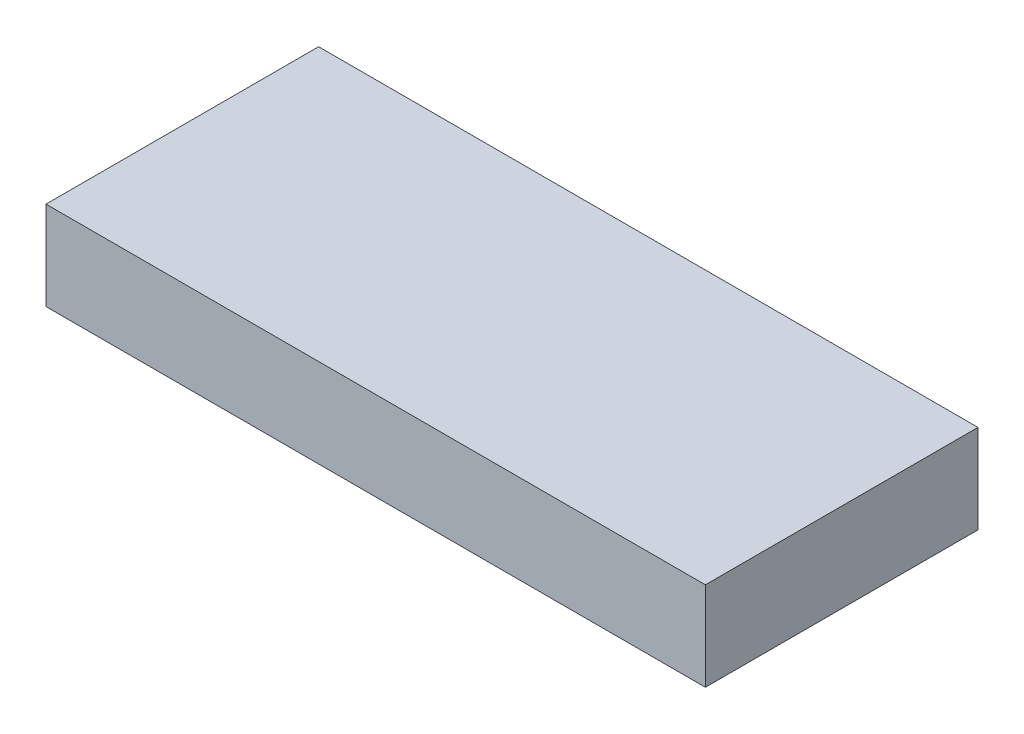
ISO-10303-21;
HEADER;
FILE_DESCRIPTION(('STEP AP214'),'2;1');
FILE_NAME('part.step','',(''),(''),'','','');
FILE_SCHEMA(('AUTOMOTIVE_DESIGN { 1 0 10303 214 1 1 1 1 }'));
ENDSEC;
DATA;
#1=APPLICATION_CONTEXT('core data for automotive mechanical design processes');
#2=APPLICATION_PROTOCOL_DEFINITION('international standard','automotive_design',2000,#1);
#3=PRODUCT_CONTEXT('',#1,'mechanical');
#4=PRODUCT('Part','Part','',(#3));
#5=PRODUCT_RELATED_PRODUCT_CATEGORY('part','',(#4));
#6=PRODUCT_DEFINITION_FORMATION('','',#4);
#7=PRODUCT_DEFINITION_CONTEXT('part definition',#1,'design');
#8=PRODUCT_DEFINITION('design','',#6,#7);
#9=PRODUCT_DEFINITION_SHAPE('','',#8);
#10=(LENGTH_UNIT() NAMED_UNIT(*) SI_UNIT(.MILLI.,.METRE.));
#11=(NAMED_UNIT(*) PLANE_ANGLE_UNIT() SI_UNIT($,.RADIAN.));
#12=(NAMED_UNIT(*) SI_UNIT($,.STERADIAN.) SOLID_ANGLE_UNIT());
#13=UNCERTAINTY_MEASURE_WITH_UNIT(LENGTH_MEASURE(1.E-05),#10,'distance_accuracy_value','');
#14=(GEOMETRIC_REPRESENTATION_CONTEXT(3) GLOBAL_UNCERTAINTY_ASSIGNED_CONTEXT((#13)) GLOBAL_UNIT_ASSIGNED_CONTEXT((#10,
#11,#12)) REPRESENTATION_CONTEXT('',''));
#15=CARTESIAN_POINT('',(0.,0.,0.));
#16=DIRECTION('',(0.,0.,1.));
#17=DIRECTION('',(1.,0.,0.));
#18=AXIS2_PLACEMENT_3D('',#15,#16,#17);
#19=CARTESIAN_POINT('',(0.,7.,0.));
#20=DIRECTION('',(1.,0.,0.));
#21=DIRECTION('',(0.,0.,-1.));
#22=AXIS2_PLACEMENT_3D('',#19,#20,#21);
#23=PLANE('',#22);
#24=DIRECTION('',(0.,0.,1.));
#25=VECTOR('',#24,1.);
#26=CARTESIAN_POINT('',(0.,0.,0.));
#27=LINE('',#26,#25);
#28=CARTESIAN_POINT('',(0.,0.,-21.5));
#29=VERTEX_POINT('',#28);
#30=CARTESIAN_POINT('',(0.,0.,0.));
#31=VERTEX_POINT('',#30);
#32=EDGE_CURVE('E99',#29,#31,#27,.T.);
#33=ORIENTED_EDGE('',*,*,#32,.T.);
#34=DIRECTION('',(0.,-1.,0.));
#35=VECTOR('',#34,1.);
#36=CARTESIAN_POINT('',(0.,7.,0.));
#37=LINE('',#36,#35);
#38=CARTESIAN_POINT('',(0.,7.,0.));
#39=VERTEX_POINT('',#38);
#40=EDGE_CURVE('E11',#39,#31,#37,.T.);
#41=ORIENTED_EDGE('',*,*,#40,.F.);
#42=DIRECTION('',(0.,0.,1.));
#43=VECTOR('',#42,1.);
#44=CARTESIAN_POINT('',(0.,7.,0.));
#45=LINE('',#44,#43);
#46=CARTESIAN_POINT('',(0.,7.,-21.5));
#47=VERTEX_POINT('',#46);
#48=EDGE_CURVE('E87',#47,#39,#45,.T.);
#49=ORIENTED_EDGE('',*,*,#48,.F.);
#50=DIRECTION('',(0.,-1.,0.));
#51=VECTOR('',#50,1.);
#52=CARTESIAN_POINT('',(0.,7.,-21.5));
#53=LINE('',#52,#51);
#54=EDGE_CURVE('E95',#47,#29,#53,.T.);
#55=ORIENTED_EDGE('',*,*,#54,.T.);
#56=EDGE_LOOP('',(#33,#41,#49,#55));
#57=FACE_BOUND('',#56,.T.);
#58=ADVANCED_FACE('F36',(#57),#23,.F.);
#59=CARTESIAN_POINT('',(0.,7.,0.));
#60=DIRECTION('',(0.,0.,-1.));
#61=DIRECTION('',(-1.,0.,0.));
#62=AXIS2_PLACEMENT_3D('',#59,#60,#61);
#63=PLANE('',#62);
#64=DIRECTION('',(1.,0.,0.));
#65=VECTOR('',#64,1.);
#66=CARTESIAN_POINT('',(0.,0.,0.));
#67=LINE('',#66,#65);
#68=CARTESIAN_POINT('',(52.,0.,0.));
#69=VERTEX_POINT('',#68);
#70=EDGE_CURVE('E91',#31,#69,#67,.T.);
#71=ORIENTED_EDGE('',*,*,#70,.T.);
#72=DIRECTION('',(0.,-1.,0.));
#73=VECTOR('',#72,1.);
#74=CARTESIAN_POINT('',(52.,7.,0.));
#75=LINE('',#74,#73);
#76=CARTESIAN_POINT('',(52.,7.,0.));
#77=VERTEX_POINT('',#76);
#78=EDGE_CURVE('E44',#77,#69,#75,.T.);
#79=ORIENTED_EDGE('',*,*,#78,.F.);
#80=DIRECTION('',(1.,0.,0.));
#81=VECTOR('',#80,1.);
#82=CARTESIAN_POINT('',(0.,7.,0.));
#83=LINE('',#82,#81);
#84=EDGE_CURVE('E82',#39,#77,#83,.T.);
#85=ORIENTED_EDGE('',*,*,#84,.F.);
#86=ORIENTED_EDGE('',*,*,#40,.T.);
#87=EDGE_LOOP('',(#71,#79,#85,#86));
#88=FACE_BOUND('',#87,.T.);
#89=ADVANCED_FACE('F90',(#88),#63,.F.);
#90=CARTESIAN_POINT('',(52.,7.,0.));
#91=DIRECTION('',(-1.,0.,0.));
#92=DIRECTION('',(0.,0.,1.));
#93=AXIS2_PLACEMENT_3D('',#90,#91,#92);
#94=PLANE('',#93);
#95=DIRECTION('',(0.,0.,-1.));
#96=VECTOR('',#95,1.);
#97=CARTESIAN_POINT('',(52.,0.,0.));
#98=LINE('',#97,#96);
#99=CARTESIAN_POINT('',(52.,0.,-21.5));
#100=VERTEX_POINT('',#99);
#101=EDGE_CURVE('E69',#69,#100,#98,.T.);
#102=ORIENTED_EDGE('',*,*,#101,.T.);
#103=DIRECTION('',(0.,-1.,0.));
#104=VECTOR('',#103,1.);
#105=CARTESIAN_POINT('',(52.,7.,-21.5));
#106=LINE('',#105,#104);
#107=CARTESIAN_POINT('',(52.,7.,-21.5));
#108=VERTEX_POINT('',#107);
#109=EDGE_CURVE('E92',#108,#100,#106,.T.);
#110=ORIENTED_EDGE('',*,*,#109,.F.);
#111=DIRECTION('',(0.,0.,-1.));
#112=VECTOR('',#111,1.);
#113=CARTESIAN_POINT('',(52.,7.,0.));
#114=LINE('',#113,#112);
#115=EDGE_CURVE('E85',#77,#108,#114,.T.);
#116=ORIENTED_EDGE('',*,*,#115,.F.);
#117=ORIENTED_EDGE('',*,*,#78,.T.);
#118=EDGE_LOOP('',(#102,#110,#116,#117));
#119=FACE_BOUND('',#118,.T.);
#120=ADVANCED_FACE('F93',(#119),#94,.F.);
#121=CARTESIAN_POINT('',(0.,7.,-21.5));
#122=DIRECTION('',(0.,0.,1.));
#123=DIRECTION('',(1.,0.,0.));
#124=AXIS2_PLACEMENT_3D('',#121,#122,#123);
#125=PLANE('',#124);
#126=DIRECTION('',(-1.,0.,0.));
#127=VECTOR('',#126,1.);
#128=CARTESIAN_POINT('',(0.,0.,-21.5));
#129=LINE('',#128,#127);
#130=EDGE_CURVE('E75',#100,#29,#129,.T.);
#131=ORIENTED_EDGE('',*,*,#130,.T.);
#132=ORIENTED_EDGE('',*,*,#54,.F.);
#133=DIRECTION('',(-1.,0.,0.));
#134=VECTOR('',#133,1.);
#135=CARTESIAN_POINT('',(0.,7.,-21.5));
#136=LINE('',#135,#134);
#137=EDGE_CURVE('E52',#108,#47,#136,.T.);
#138=ORIENTED_EDGE('',*,*,#137,.F.);
#139=ORIENTED_EDGE('',*,*,#109,.T.);
#140=EDGE_LOOP('',(#131,#132,#138,#139));
#141=FACE_BOUND('',#140,.T.);
#142=ADVANCED_FACE('F106',(#141),#125,.F.);
#143=CARTESIAN_POINT('',(0.,7.,0.));
#144=DIRECTION('',(0.,-1.,0.));
#145=DIRECTION('',(0.,0.,-1.));
#146=AXIS2_PLACEMENT_3D('',#143,#144,#145);
#147=PLANE('',#146);
#148=ORIENTED_EDGE('',*,*,#48,.T.);
#149=ORIENTED_EDGE('',*,*,#84,.T.);
#150=ORIENTED_EDGE('',*,*,#115,.T.);
#151=ORIENTED_EDGE('',*,*,#137,.T.);
#152=EDGE_LOOP('',(#148,#149,#150,#151));
#153=FACE_BOUND('',#152,.T.);
#154=ADVANCED_FACE('F83',(#153),#147,.F.);
#155=CARTESIAN_POINT('',(0.,0.,0.));
#156=DIRECTION('',(0.,-1.,0.));
#157=DIRECTION('',(0.,0.,-1.));
#158=AXIS2_PLACEMENT_3D('',#155,#156,#157);
#159=PLANE('',#158);
#160=ORIENTED_EDGE('',*,*,#32,.F.);
#161=ORIENTED_EDGE('',*,*,#130,.F.);
#162=ORIENTED_EDGE('',*,*,#101,.F.);
#163=ORIENTED_EDGE('',*,*,#70,.F.);
#164=EDGE_LOOP('',(#160,#161,#162,#163));
#165=FACE_BOUND('',#164,.T.);
#166=ADVANCED_FACE('F109',(#165),#159,.T.);
#167=CLOSED_SHELL('',(#58,#89,#120,#142,#154,#166));
#168=MANIFOLD_SOLID_BREP('B2',#167);
#169=ADVANCED_BREP_SHAPE_REPRESENTATION('',(#18,#168),#14);
#170=SHAPE_DEFINITION_REPRESENTATION(#9,#169);
ENDSEC;
END-ISO-10303-21;
